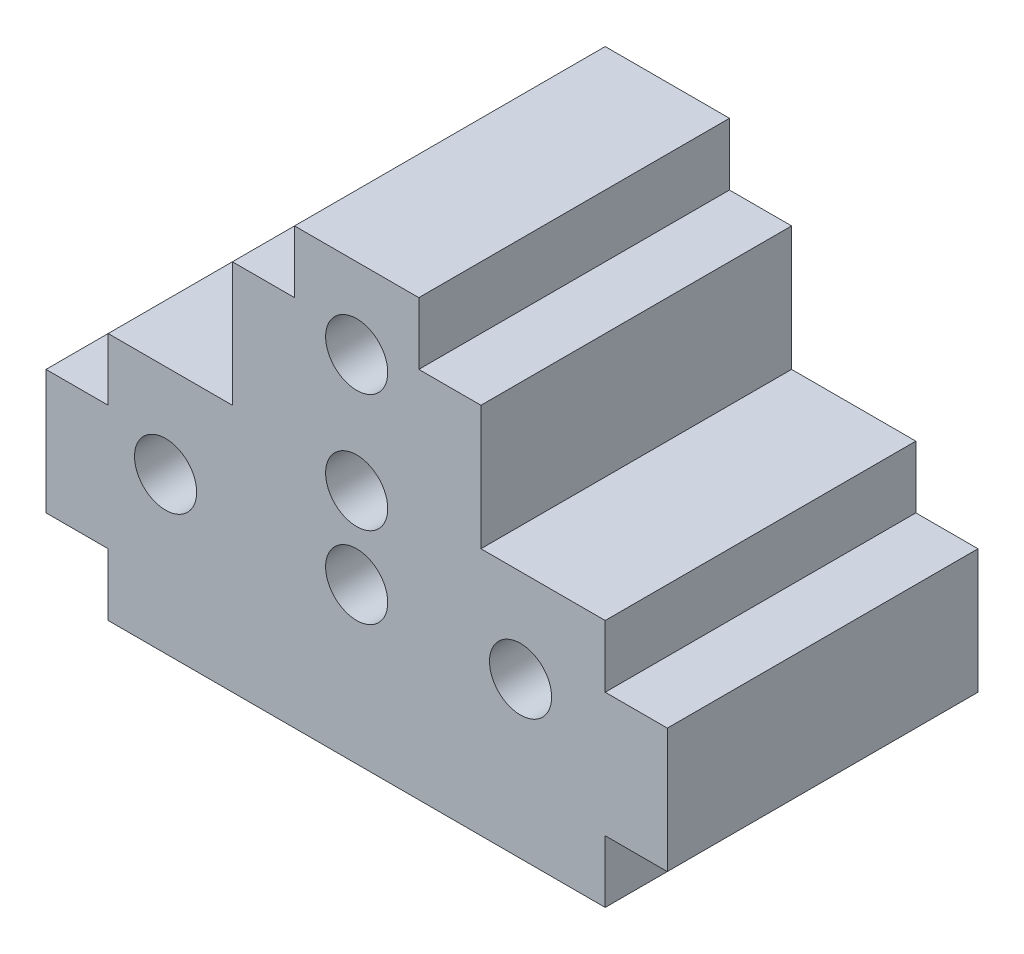
ISO-10303-21;
HEADER;
FILE_DESCRIPTION(('STEP AP214'),'2;1');
FILE_NAME('part.step','',(''),(''),'','','');
FILE_SCHEMA(('AUTOMOTIVE_DESIGN { 1 0 10303 214 1 1 1 1 }'));
ENDSEC;
DATA;
#1=APPLICATION_CONTEXT('core data for automotive mechanical design processes');
#2=APPLICATION_PROTOCOL_DEFINITION('international standard','automotive_design',2000,#1);
#3=PRODUCT_CONTEXT('',#1,'mechanical');
#4=PRODUCT('Part','Part','',(#3));
#5=PRODUCT_RELATED_PRODUCT_CATEGORY('part','',(#4));
#6=PRODUCT_DEFINITION_FORMATION('','',#4);
#7=PRODUCT_DEFINITION_CONTEXT('part definition',#1,'design');
#8=PRODUCT_DEFINITION('design','',#6,#7);
#9=PRODUCT_DEFINITION_SHAPE('','',#8);
#10=(LENGTH_UNIT() NAMED_UNIT(*) SI_UNIT(.MILLI.,.METRE.));
#11=(NAMED_UNIT(*) PLANE_ANGLE_UNIT() SI_UNIT($,.RADIAN.));
#12=(NAMED_UNIT(*) SI_UNIT($,.STERADIAN.) SOLID_ANGLE_UNIT());
#13=UNCERTAINTY_MEASURE_WITH_UNIT(LENGTH_MEASURE(1.E-05),#10,'distance_accuracy_value','');
#14=(GEOMETRIC_REPRESENTATION_CONTEXT(3) GLOBAL_UNCERTAINTY_ASSIGNED_CONTEXT((#13)) GLOBAL_UNIT_ASSIGNED_CONTEXT((#10,
#11,#12)) REPRESENTATION_CONTEXT('',''));
#15=CARTESIAN_POINT('',(0.,0.,0.));
#16=DIRECTION('',(0.,0.,1.));
#17=DIRECTION('',(1.,0.,0.));
#18=AXIS2_PLACEMENT_3D('',#15,#16,#17);
#19=CARTESIAN_POINT('',(-8.,0.,5.));
#20=DIRECTION('',(0.,1.,0.));
#21=DIRECTION('',(0.,0.,1.));
#22=AXIS2_PLACEMENT_3D('',#19,#20,#21);
#23=PLANE('',#22);
#24=DIRECTION('',(1.,0.,0.));
#25=VECTOR('',#24,1.);
#26=CARTESIAN_POINT('',(-8.,0.,-5.));
#27=LINE('',#26,#25);
#28=CARTESIAN_POINT('',(-8.,0.,-5.));
#29=VERTEX_POINT('',#28);
#30=CARTESIAN_POINT('',(8.,0.,-5.));
#31=VERTEX_POINT('',#30);
#32=EDGE_CURVE('E215',#29,#31,#27,.T.);
#33=ORIENTED_EDGE('',*,*,#32,.T.);
#34=DIRECTION('',(0.,0.,-1.));
#35=VECTOR('',#34,1.);
#36=CARTESIAN_POINT('',(8.,0.,5.));
#37=LINE('',#36,#35);
#38=CARTESIAN_POINT('',(8.,0.,5.));
#39=VERTEX_POINT('',#38);
#40=EDGE_CURVE('E11',#39,#31,#37,.T.);
#41=ORIENTED_EDGE('',*,*,#40,.F.);
#42=DIRECTION('',(1.,0.,0.));
#43=VECTOR('',#42,1.);
#44=CARTESIAN_POINT('',(-8.,0.,5.));
#45=LINE('',#44,#43);
#46=CARTESIAN_POINT('',(-8.,0.,5.));
#47=VERTEX_POINT('',#46);
#48=EDGE_CURVE('E274',#47,#39,#45,.T.);
#49=ORIENTED_EDGE('',*,*,#48,.F.);
#50=DIRECTION('',(0.,0.,-1.));
#51=VECTOR('',#50,1.);
#52=CARTESIAN_POINT('',(-8.,0.,5.));
#53=LINE('',#52,#51);
#54=EDGE_CURVE('E211',#47,#29,#53,.T.);
#55=ORIENTED_EDGE('',*,*,#54,.T.);
#56=EDGE_LOOP('',(#33,#41,#49,#55));
#57=FACE_BOUND('',#56,.T.);
#58=ADVANCED_FACE('F42',(#57),#23,.F.);
#59=CARTESIAN_POINT('',(8.,0.,5.));
#60=DIRECTION('',(-1.,0.,0.));
#61=DIRECTION('',(0.,0.,1.));
#62=AXIS2_PLACEMENT_3D('',#59,#60,#61);
#63=PLANE('',#62);
#64=DIRECTION('',(0.,1.,0.));
#65=VECTOR('',#64,1.);
#66=CARTESIAN_POINT('',(8.,0.,-5.));
#67=LINE('',#66,#65);
#68=CARTESIAN_POINT('',(8.,2.,-5.));
#69=VERTEX_POINT('',#68);
#70=EDGE_CURVE('E219',#31,#69,#67,.T.);
#71=ORIENTED_EDGE('',*,*,#70,.T.);
#72=DIRECTION('',(0.,0.,-1.));
#73=VECTOR('',#72,1.);
#74=CARTESIAN_POINT('',(8.,2.,5.));
#75=LINE('',#74,#73);
#76=CARTESIAN_POINT('',(8.,2.,5.));
#77=VERTEX_POINT('',#76);
#78=EDGE_CURVE('E51',#77,#69,#75,.T.);
#79=ORIENTED_EDGE('',*,*,#78,.F.);
#80=DIRECTION('',(0.,1.,0.));
#81=VECTOR('',#80,1.);
#82=CARTESIAN_POINT('',(8.,0.,5.));
#83=LINE('',#82,#81);
#84=EDGE_CURVE('E138',#39,#77,#83,.T.);
#85=ORIENTED_EDGE('',*,*,#84,.F.);
#86=ORIENTED_EDGE('',*,*,#40,.T.);
#87=EDGE_LOOP('',(#71,#79,#85,#86));
#88=FACE_BOUND('',#87,.T.);
#89=ADVANCED_FACE('F426',(#88),#63,.F.);
#90=CARTESIAN_POINT('',(8.,2.,5.));
#91=DIRECTION('',(0.,1.,0.));
#92=DIRECTION('',(-1.,0.,0.));
#93=AXIS2_PLACEMENT_3D('',#90,#91,#92);
#94=PLANE('',#93);
#95=DIRECTION('',(1.,0.,0.));
#96=VECTOR('',#95,1.);
#97=CARTESIAN_POINT('',(8.,2.,-5.));
#98=LINE('',#97,#96);
#99=CARTESIAN_POINT('',(10.,2.,-5.));
#100=VERTEX_POINT('',#99);
#101=EDGE_CURVE('E223',#69,#100,#98,.T.);
#102=ORIENTED_EDGE('',*,*,#101,.T.);
#103=DIRECTION('',(0.,0.,-1.));
#104=VECTOR('',#103,1.);
#105=CARTESIAN_POINT('',(10.,2.,5.));
#106=LINE('',#105,#104);
#107=CARTESIAN_POINT('',(10.,2.,5.));
#108=VERTEX_POINT('',#107);
#109=EDGE_CURVE('E333',#108,#100,#106,.T.);
#110=ORIENTED_EDGE('',*,*,#109,.F.);
#111=DIRECTION('',(1.,0.,0.));
#112=VECTOR('',#111,1.);
#113=CARTESIAN_POINT('',(8.,2.,5.));
#114=LINE('',#113,#112);
#115=EDGE_CURVE('E343',#77,#108,#114,.T.);
#116=ORIENTED_EDGE('',*,*,#115,.F.);
#117=ORIENTED_EDGE('',*,*,#78,.T.);
#118=EDGE_LOOP('',(#102,#110,#116,#117));
#119=FACE_BOUND('',#118,.T.);
#120=ADVANCED_FACE('F341',(#119),#94,.F.);
#121=CARTESIAN_POINT('',(10.,2.,5.));
#122=DIRECTION('',(-1.,0.,0.));
#123=DIRECTION('',(0.,0.,1.));
#124=AXIS2_PLACEMENT_3D('',#121,#122,#123);
#125=PLANE('',#124);
#126=DIRECTION('',(0.,1.,0.));
#127=VECTOR('',#126,1.);
#128=CARTESIAN_POINT('',(10.,2.,-5.));
#129=LINE('',#128,#127);
#130=CARTESIAN_POINT('',(10.,6.,-5.));
#131=VERTEX_POINT('',#130);
#132=EDGE_CURVE('E226',#100,#131,#129,.T.);
#133=ORIENTED_EDGE('',*,*,#132,.T.);
#134=DIRECTION('',(0.,0.,-1.));
#135=VECTOR('',#134,1.);
#136=CARTESIAN_POINT('',(10.,6.,5.));
#137=LINE('',#136,#135);
#138=CARTESIAN_POINT('',(10.,6.,5.));
#139=VERTEX_POINT('',#138);
#140=EDGE_CURVE('E329',#139,#131,#137,.T.);
#141=ORIENTED_EDGE('',*,*,#140,.F.);
#142=DIRECTION('',(0.,1.,0.));
#143=VECTOR('',#142,1.);
#144=CARTESIAN_POINT('',(10.,2.,5.));
#145=LINE('',#144,#143);
#146=EDGE_CURVE('E362',#108,#139,#145,.T.);
#147=ORIENTED_EDGE('',*,*,#146,.F.);
#148=ORIENTED_EDGE('',*,*,#109,.T.);
#149=EDGE_LOOP('',(#133,#141,#147,#148));
#150=FACE_BOUND('',#149,.T.);
#151=ADVANCED_FACE('F352',(#150),#125,.F.);
#152=CARTESIAN_POINT('',(10.,6.,5.));
#153=DIRECTION('',(0.,-1.,0.));
#154=DIRECTION('',(0.,0.,-1.));
#155=AXIS2_PLACEMENT_3D('',#152,#153,#154);
#156=PLANE('',#155);
#157=DIRECTION('',(-1.,0.,0.));
#158=VECTOR('',#157,1.);
#159=CARTESIAN_POINT('',(10.,6.,-5.));
#160=LINE('',#159,#158);
#161=CARTESIAN_POINT('',(8.,6.,-5.));
#162=VERTEX_POINT('',#161);
#163=EDGE_CURVE('E229',#131,#162,#160,.T.);
#164=ORIENTED_EDGE('',*,*,#163,.T.);
#165=DIRECTION('',(0.,0.,-1.));
#166=VECTOR('',#165,1.);
#167=CARTESIAN_POINT('',(8.,6.,5.));
#168=LINE('',#167,#166);
#169=CARTESIAN_POINT('',(8.,6.,5.));
#170=VERTEX_POINT('',#169);
#171=EDGE_CURVE('E325',#170,#162,#168,.T.);
#172=ORIENTED_EDGE('',*,*,#171,.F.);
#173=DIRECTION('',(-1.,0.,0.));
#174=VECTOR('',#173,1.);
#175=CARTESIAN_POINT('',(10.,6.,5.));
#176=LINE('',#175,#174);
#177=EDGE_CURVE('E358',#139,#170,#176,.T.);
#178=ORIENTED_EDGE('',*,*,#177,.F.);
#179=ORIENTED_EDGE('',*,*,#140,.T.);
#180=EDGE_LOOP('',(#164,#172,#178,#179));
#181=FACE_BOUND('',#180,.T.);
#182=ADVANCED_FACE('F356',(#181),#156,.F.);
#183=CARTESIAN_POINT('',(8.,6.,5.));
#184=DIRECTION('',(-1.,0.,0.));
#185=DIRECTION('',(0.,0.,1.));
#186=AXIS2_PLACEMENT_3D('',#183,#184,#185);
#187=PLANE('',#186);
#188=DIRECTION('',(0.,1.,0.));
#189=VECTOR('',#188,1.);
#190=CARTESIAN_POINT('',(8.,6.,-5.));
#191=LINE('',#190,#189);
#192=CARTESIAN_POINT('',(8.,8.,-5.));
#193=VERTEX_POINT('',#192);
#194=EDGE_CURVE('E232',#162,#193,#191,.T.);
#195=ORIENTED_EDGE('',*,*,#194,.T.);
#196=DIRECTION('',(0.,0.,-1.));
#197=VECTOR('',#196,1.);
#198=CARTESIAN_POINT('',(8.,8.,5.));
#199=LINE('',#198,#197);
#200=CARTESIAN_POINT('',(8.,8.,5.));
#201=VERTEX_POINT('',#200);
#202=EDGE_CURVE('E321',#201,#193,#199,.T.);
#203=ORIENTED_EDGE('',*,*,#202,.F.);
#204=DIRECTION('',(0.,1.,0.));
#205=VECTOR('',#204,1.);
#206=CARTESIAN_POINT('',(8.,6.,5.));
#207=LINE('',#206,#205);
#208=EDGE_CURVE('E361',#170,#201,#207,.T.);
#209=ORIENTED_EDGE('',*,*,#208,.F.);
#210=ORIENTED_EDGE('',*,*,#171,.T.);
#211=EDGE_LOOP('',(#195,#203,#209,#210));
#212=FACE_BOUND('',#211,.T.);
#213=ADVANCED_FACE('F439',(#212),#187,.F.);
#214=CARTESIAN_POINT('',(8.,8.,5.));
#215=DIRECTION('',(0.,-1.,0.));
#216=DIRECTION('',(0.,0.,-1.));
#217=AXIS2_PLACEMENT_3D('',#214,#215,#216);
#218=PLANE('',#217);
#219=DIRECTION('',(-1.,0.,0.));
#220=VECTOR('',#219,1.);
#221=CARTESIAN_POINT('',(8.,8.,-5.));
#222=LINE('',#221,#220);
#223=CARTESIAN_POINT('',(4.,8.,-5.));
#224=VERTEX_POINT('',#223);
#225=EDGE_CURVE('E235',#193,#224,#222,.T.);
#226=ORIENTED_EDGE('',*,*,#225,.T.);
#227=DIRECTION('',(0.,0.,-1.));
#228=VECTOR('',#227,1.);
#229=CARTESIAN_POINT('',(4.,8.,5.));
#230=LINE('',#229,#228);
#231=CARTESIAN_POINT('',(4.,8.,5.));
#232=VERTEX_POINT('',#231);
#233=EDGE_CURVE('E317',#232,#224,#230,.T.);
#234=ORIENTED_EDGE('',*,*,#233,.F.);
#235=DIRECTION('',(-1.,0.,0.));
#236=VECTOR('',#235,1.);
#237=CARTESIAN_POINT('',(8.,8.,5.));
#238=LINE('',#237,#236);
#239=EDGE_CURVE('E366',#201,#232,#238,.T.);
#240=ORIENTED_EDGE('',*,*,#239,.F.);
#241=ORIENTED_EDGE('',*,*,#202,.T.);
#242=EDGE_LOOP('',(#226,#234,#240,#241));
#243=FACE_BOUND('',#242,.T.);
#244=ADVANCED_FACE('F442',(#243),#218,.F.);
#245=CARTESIAN_POINT('',(4.,8.,5.));
#246=DIRECTION('',(-1.,0.,0.));
#247=DIRECTION('',(0.,0.,1.));
#248=AXIS2_PLACEMENT_3D('',#245,#246,#247);
#249=PLANE('',#248);
#250=DIRECTION('',(0.,1.,0.));
#251=VECTOR('',#250,1.);
#252=CARTESIAN_POINT('',(4.,8.,-5.));
#253=LINE('',#252,#251);
#254=CARTESIAN_POINT('',(4.,12.,-5.));
#255=VERTEX_POINT('',#254);
#256=EDGE_CURVE('E238',#224,#255,#253,.T.);
#257=ORIENTED_EDGE('',*,*,#256,.T.);
#258=DIRECTION('',(0.,0.,-1.));
#259=VECTOR('',#258,1.);
#260=CARTESIAN_POINT('',(4.,12.,5.));
#261=LINE('',#260,#259);
#262=CARTESIAN_POINT('',(4.,12.,5.));
#263=VERTEX_POINT('',#262);
#264=EDGE_CURVE('E313',#263,#255,#261,.T.);
#265=ORIENTED_EDGE('',*,*,#264,.F.);
#266=DIRECTION('',(0.,1.,0.));
#267=VECTOR('',#266,1.);
#268=CARTESIAN_POINT('',(4.,8.,5.));
#269=LINE('',#268,#267);
#270=EDGE_CURVE('E373',#232,#263,#269,.T.);
#271=ORIENTED_EDGE('',*,*,#270,.F.);
#272=ORIENTED_EDGE('',*,*,#233,.T.);
#273=EDGE_LOOP('',(#257,#265,#271,#272));
#274=FACE_BOUND('',#273,.T.);
#275=ADVANCED_FACE('F446',(#274),#249,.F.);
#276=CARTESIAN_POINT('',(4.,12.,5.));
#277=DIRECTION('',(0.,-1.,0.));
#278=DIRECTION('',(0.,0.,-1.));
#279=AXIS2_PLACEMENT_3D('',#276,#277,#278);
#280=PLANE('',#279);
#281=DIRECTION('',(-1.,0.,0.));
#282=VECTOR('',#281,1.);
#283=CARTESIAN_POINT('',(4.,12.,-5.));
#284=LINE('',#283,#282);
#285=CARTESIAN_POINT('',(2.,12.,-5.));
#286=VERTEX_POINT('',#285);
#287=EDGE_CURVE('E241',#255,#286,#284,.T.);
#288=ORIENTED_EDGE('',*,*,#287,.T.);
#289=DIRECTION('',(0.,0.,-1.));
#290=VECTOR('',#289,1.);
#291=CARTESIAN_POINT('',(2.,12.,5.));
#292=LINE('',#291,#290);
#293=CARTESIAN_POINT('',(2.,12.,5.));
#294=VERTEX_POINT('',#293);
#295=EDGE_CURVE('E309',#294,#286,#292,.T.);
#296=ORIENTED_EDGE('',*,*,#295,.F.);
#297=DIRECTION('',(-1.,0.,0.));
#298=VECTOR('',#297,1.);
#299=CARTESIAN_POINT('',(4.,12.,5.));
#300=LINE('',#299,#298);
#301=EDGE_CURVE('E376',#263,#294,#300,.T.);
#302=ORIENTED_EDGE('',*,*,#301,.F.);
#303=ORIENTED_EDGE('',*,*,#264,.T.);
#304=EDGE_LOOP('',(#288,#296,#302,#303));
#305=FACE_BOUND('',#304,.T.);
#306=ADVANCED_FACE('F450',(#305),#280,.F.);
#307=CARTESIAN_POINT('',(2.,12.,5.));
#308=DIRECTION('',(-1.,0.,0.));
#309=DIRECTION('',(0.,0.,1.));
#310=AXIS2_PLACEMENT_3D('',#307,#308,#309);
#311=PLANE('',#310);
#312=DIRECTION('',(0.,1.,0.));
#313=VECTOR('',#312,1.);
#314=CARTESIAN_POINT('',(2.,12.,-5.));
#315=LINE('',#314,#313);
#316=CARTESIAN_POINT('',(2.,14.,-5.));
#317=VERTEX_POINT('',#316);
#318=EDGE_CURVE('E244',#286,#317,#315,.T.);
#319=ORIENTED_EDGE('',*,*,#318,.T.);
#320=DIRECTION('',(0.,0.,-1.));
#321=VECTOR('',#320,1.);
#322=CARTESIAN_POINT('',(2.,14.,5.));
#323=LINE('',#322,#321);
#324=CARTESIAN_POINT('',(2.,14.,5.));
#325=VERTEX_POINT('',#324);
#326=EDGE_CURVE('E305',#325,#317,#323,.T.);
#327=ORIENTED_EDGE('',*,*,#326,.F.);
#328=DIRECTION('',(0.,1.,0.));
#329=VECTOR('',#328,1.);
#330=CARTESIAN_POINT('',(2.,12.,5.));
#331=LINE('',#330,#329);
#332=EDGE_CURVE('E379',#294,#325,#331,.T.);
#333=ORIENTED_EDGE('',*,*,#332,.F.);
#334=ORIENTED_EDGE('',*,*,#295,.T.);
#335=EDGE_LOOP('',(#319,#327,#333,#334));
#336=FACE_BOUND('',#335,.T.);
#337=ADVANCED_FACE('F454',(#336),#311,.F.);
#338=CARTESIAN_POINT('',(-2.,14.,5.));
#339=DIRECTION('',(0.,-1.,0.));
#340=DIRECTION('',(0.,0.,-1.));
#341=AXIS2_PLACEMENT_3D('',#338,#339,#340);
#342=PLANE('',#341);
#343=DIRECTION('',(-1.,0.,0.));
#344=VECTOR('',#343,1.);
#345=CARTESIAN_POINT('',(-2.,14.,-5.));
#346=LINE('',#345,#344);
#347=CARTESIAN_POINT('',(-2.,14.,-5.));
#348=VERTEX_POINT('',#347);
#349=EDGE_CURVE('E247',#317,#348,#346,.T.);
#350=ORIENTED_EDGE('',*,*,#349,.T.);
#351=DIRECTION('',(0.,0.,-1.));
#352=VECTOR('',#351,1.);
#353=CARTESIAN_POINT('',(-2.,14.,5.));
#354=LINE('',#353,#352);
#355=CARTESIAN_POINT('',(-2.,14.,5.));
#356=VERTEX_POINT('',#355);
#357=EDGE_CURVE('E301',#356,#348,#354,.T.);
#358=ORIENTED_EDGE('',*,*,#357,.F.);
#359=DIRECTION('',(-1.,0.,0.));
#360=VECTOR('',#359,1.);
#361=CARTESIAN_POINT('',(-2.,14.,5.));
#362=LINE('',#361,#360);
#363=EDGE_CURVE('E382',#325,#356,#362,.T.);
#364=ORIENTED_EDGE('',*,*,#363,.F.);
#365=ORIENTED_EDGE('',*,*,#326,.T.);
#366=EDGE_LOOP('',(#350,#358,#364,#365));
#367=FACE_BOUND('',#366,.T.);
#368=ADVANCED_FACE('F458',(#367),#342,.F.);
#369=CARTESIAN_POINT('',(-2.,12.,5.));
#370=DIRECTION('',(1.,0.,0.));
#371=DIRECTION('',(0.,0.,-1.));
#372=AXIS2_PLACEMENT_3D('',#369,#370,#371);
#373=PLANE('',#372);
#374=DIRECTION('',(0.,-1.,0.));
#375=VECTOR('',#374,1.);
#376=CARTESIAN_POINT('',(-2.,12.,-5.));
#377=LINE('',#376,#375);
#378=CARTESIAN_POINT('',(-2.,12.,-5.));
#379=VERTEX_POINT('',#378);
#380=EDGE_CURVE('E250',#348,#379,#377,.T.);
#381=ORIENTED_EDGE('',*,*,#380,.T.);
#382=DIRECTION('',(0.,0.,-1.));
#383=VECTOR('',#382,1.);
#384=CARTESIAN_POINT('',(-2.,12.,5.));
#385=LINE('',#384,#383);
#386=CARTESIAN_POINT('',(-2.,12.,5.));
#387=VERTEX_POINT('',#386);
#388=EDGE_CURVE('E297',#387,#379,#385,.T.);
#389=ORIENTED_EDGE('',*,*,#388,.F.);
#390=DIRECTION('',(0.,-1.,0.));
#391=VECTOR('',#390,1.);
#392=CARTESIAN_POINT('',(-2.,12.,5.));
#393=LINE('',#392,#391);
#394=EDGE_CURVE('E385',#356,#387,#393,.T.);
#395=ORIENTED_EDGE('',*,*,#394,.F.);
#396=ORIENTED_EDGE('',*,*,#357,.T.);
#397=EDGE_LOOP('',(#381,#389,#395,#396));
#398=FACE_BOUND('',#397,.T.);
#399=ADVANCED_FACE('F462',(#398),#373,.F.);
#400=CARTESIAN_POINT('',(-4.,12.,5.));
#401=DIRECTION('',(0.,-1.,0.));
#402=DIRECTION('',(0.,0.,-1.));
#403=AXIS2_PLACEMENT_3D('',#400,#401,#402);
#404=PLANE('',#403);
#405=DIRECTION('',(-1.,0.,0.));
#406=VECTOR('',#405,1.);
#407=CARTESIAN_POINT('',(-4.,12.,-5.));
#408=LINE('',#407,#406);
#409=CARTESIAN_POINT('',(-4.,12.,-5.));
#410=VERTEX_POINT('',#409);
#411=EDGE_CURVE('E253',#379,#410,#408,.T.);
#412=ORIENTED_EDGE('',*,*,#411,.T.);
#413=DIRECTION('',(0.,0.,-1.));
#414=VECTOR('',#413,1.);
#415=CARTESIAN_POINT('',(-4.,12.,5.));
#416=LINE('',#415,#414);
#417=CARTESIAN_POINT('',(-4.,12.,5.));
#418=VERTEX_POINT('',#417);
#419=EDGE_CURVE('E293',#418,#410,#416,.T.);
#420=ORIENTED_EDGE('',*,*,#419,.F.);
#421=DIRECTION('',(-1.,0.,0.));
#422=VECTOR('',#421,1.);
#423=CARTESIAN_POINT('',(-4.,12.,5.));
#424=LINE('',#423,#422);
#425=EDGE_CURVE('E388',#387,#418,#424,.T.);
#426=ORIENTED_EDGE('',*,*,#425,.F.);
#427=ORIENTED_EDGE('',*,*,#388,.T.);
#428=EDGE_LOOP('',(#412,#420,#426,#427));
#429=FACE_BOUND('',#428,.T.);
#430=ADVANCED_FACE('F466',(#429),#404,.F.);
#431=CARTESIAN_POINT('',(-4.,8.,5.));
#432=DIRECTION('',(1.,0.,0.));
#433=DIRECTION('',(0.,0.,-1.));
#434=AXIS2_PLACEMENT_3D('',#431,#432,#433);
#435=PLANE('',#434);
#436=DIRECTION('',(0.,-1.,0.));
#437=VECTOR('',#436,1.);
#438=CARTESIAN_POINT('',(-4.,8.,-5.));
#439=LINE('',#438,#437);
#440=CARTESIAN_POINT('',(-4.,8.,-5.));
#441=VERTEX_POINT('',#440);
#442=EDGE_CURVE('E256',#410,#441,#439,.T.);
#443=ORIENTED_EDGE('',*,*,#442,.T.);
#444=DIRECTION('',(0.,0.,-1.));
#445=VECTOR('',#444,1.);
#446=CARTESIAN_POINT('',(-4.,8.,5.));
#447=LINE('',#446,#445);
#448=CARTESIAN_POINT('',(-4.,8.,5.));
#449=VERTEX_POINT('',#448);
#450=EDGE_CURVE('E289',#449,#441,#447,.T.);
#451=ORIENTED_EDGE('',*,*,#450,.F.);
#452=DIRECTION('',(0.,-1.,0.));
#453=VECTOR('',#452,1.);
#454=CARTESIAN_POINT('',(-4.,8.,5.));
#455=LINE('',#454,#453);
#456=EDGE_CURVE('E391',#418,#449,#455,.T.);
#457=ORIENTED_EDGE('',*,*,#456,.F.);
#458=ORIENTED_EDGE('',*,*,#419,.T.);
#459=EDGE_LOOP('',(#443,#451,#457,#458));
#460=FACE_BOUND('',#459,.T.);
#461=ADVANCED_FACE('F470',(#460),#435,.F.);
#462=CARTESIAN_POINT('',(-8.,8.,5.));
#463=DIRECTION('',(0.,-1.,0.));
#464=DIRECTION('',(0.,0.,-1.));
#465=AXIS2_PLACEMENT_3D('',#462,#463,#464);
#466=PLANE('',#465);
#467=DIRECTION('',(-1.,0.,0.));
#468=VECTOR('',#467,1.);
#469=CARTESIAN_POINT('',(-8.,8.,-5.));
#470=LINE('',#469,#468);
#471=CARTESIAN_POINT('',(-8.,8.,-5.));
#472=VERTEX_POINT('',#471);
#473=EDGE_CURVE('E259',#441,#472,#470,.T.);
#474=ORIENTED_EDGE('',*,*,#473,.T.);
#475=DIRECTION('',(0.,0.,-1.));
#476=VECTOR('',#475,1.);
#477=CARTESIAN_POINT('',(-8.,8.,5.));
#478=LINE('',#477,#476);
#479=CARTESIAN_POINT('',(-8.,8.,5.));
#480=VERTEX_POINT('',#479);
#481=EDGE_CURVE('E285',#480,#472,#478,.T.);
#482=ORIENTED_EDGE('',*,*,#481,.F.);
#483=DIRECTION('',(-1.,0.,0.));
#484=VECTOR('',#483,1.);
#485=CARTESIAN_POINT('',(-8.,8.,5.));
#486=LINE('',#485,#484);
#487=EDGE_CURVE('E394',#449,#480,#486,.T.);
#488=ORIENTED_EDGE('',*,*,#487,.F.);
#489=ORIENTED_EDGE('',*,*,#450,.T.);
#490=EDGE_LOOP('',(#474,#482,#488,#489));
#491=FACE_BOUND('',#490,.T.);
#492=ADVANCED_FACE('F474',(#491),#466,.F.);
#493=CARTESIAN_POINT('',(-8.,6.,5.));
#494=DIRECTION('',(1.,0.,0.));
#495=DIRECTION('',(0.,0.,-1.));
#496=AXIS2_PLACEMENT_3D('',#493,#494,#495);
#497=PLANE('',#496);
#498=DIRECTION('',(0.,-1.,0.));
#499=VECTOR('',#498,1.);
#500=CARTESIAN_POINT('',(-8.,6.,-5.));
#501=LINE('',#500,#499);
#502=CARTESIAN_POINT('',(-8.,6.,-5.));
#503=VERTEX_POINT('',#502);
#504=EDGE_CURVE('E262',#472,#503,#501,.T.);
#505=ORIENTED_EDGE('',*,*,#504,.T.);
#506=DIRECTION('',(0.,0.,-1.));
#507=VECTOR('',#506,1.);
#508=CARTESIAN_POINT('',(-8.,6.,5.));
#509=LINE('',#508,#507);
#510=CARTESIAN_POINT('',(-8.,6.,5.));
#511=VERTEX_POINT('',#510);
#512=EDGE_CURVE('E281',#511,#503,#509,.T.);
#513=ORIENTED_EDGE('',*,*,#512,.F.);
#514=DIRECTION('',(0.,-1.,0.));
#515=VECTOR('',#514,1.);
#516=CARTESIAN_POINT('',(-8.,6.,5.));
#517=LINE('',#516,#515);
#518=EDGE_CURVE('E397',#480,#511,#517,.T.);
#519=ORIENTED_EDGE('',*,*,#518,.F.);
#520=ORIENTED_EDGE('',*,*,#481,.T.);
#521=EDGE_LOOP('',(#505,#513,#519,#520));
#522=FACE_BOUND('',#521,.T.);
#523=ADVANCED_FACE('F405',(#522),#497,.F.);
#524=CARTESIAN_POINT('',(-10.,6.,5.));
#525=DIRECTION('',(0.,-1.,0.));
#526=DIRECTION('',(0.,0.,-1.));
#527=AXIS2_PLACEMENT_3D('',#524,#525,#526);
#528=PLANE('',#527);
#529=DIRECTION('',(-1.,0.,0.));
#530=VECTOR('',#529,1.);
#531=CARTESIAN_POINT('',(-10.,6.,-5.));
#532=LINE('',#531,#530);
#533=CARTESIAN_POINT('',(-10.,6.,-5.));
#534=VERTEX_POINT('',#533);
#535=EDGE_CURVE('E265',#503,#534,#532,.T.);
#536=ORIENTED_EDGE('',*,*,#535,.T.);
#537=DIRECTION('',(0.,0.,-1.));
#538=VECTOR('',#537,1.);
#539=CARTESIAN_POINT('',(-10.,6.,5.));
#540=LINE('',#539,#538);
#541=CARTESIAN_POINT('',(-10.,6.,5.));
#542=VERTEX_POINT('',#541);
#543=EDGE_CURVE('E204',#542,#534,#540,.T.);
#544=ORIENTED_EDGE('',*,*,#543,.F.);
#545=DIRECTION('',(-1.,0.,0.));
#546=VECTOR('',#545,1.);
#547=CARTESIAN_POINT('',(-10.,6.,5.));
#548=LINE('',#547,#546);
#549=EDGE_CURVE('E193',#511,#542,#548,.T.);
#550=ORIENTED_EDGE('',*,*,#549,.F.);
#551=ORIENTED_EDGE('',*,*,#512,.T.);
#552=EDGE_LOOP('',(#536,#544,#550,#551));
#553=FACE_BOUND('',#552,.T.);
#554=ADVANCED_FACE('F409',(#553),#528,.F.);
#555=CARTESIAN_POINT('',(-10.,2.,5.));
#556=DIRECTION('',(1.,0.,0.));
#557=DIRECTION('',(0.,0.,-1.));
#558=AXIS2_PLACEMENT_3D('',#555,#556,#557);
#559=PLANE('',#558);
#560=DIRECTION('',(0.,-1.,0.));
#561=VECTOR('',#560,1.);
#562=CARTESIAN_POINT('',(-10.,2.,-5.));
#563=LINE('',#562,#561);
#564=CARTESIAN_POINT('',(-10.,2.,-5.));
#565=VERTEX_POINT('',#564);
#566=EDGE_CURVE('E202',#534,#565,#563,.T.);
#567=ORIENTED_EDGE('',*,*,#566,.T.);
#568=DIRECTION('',(0.,0.,-1.));
#569=VECTOR('',#568,1.);
#570=CARTESIAN_POINT('',(-10.,2.,5.));
#571=LINE('',#570,#569);
#572=CARTESIAN_POINT('',(-10.,2.,5.));
#573=VERTEX_POINT('',#572);
#574=EDGE_CURVE('E199',#573,#565,#571,.T.);
#575=ORIENTED_EDGE('',*,*,#574,.F.);
#576=DIRECTION('',(0.,-1.,0.));
#577=VECTOR('',#576,1.);
#578=CARTESIAN_POINT('',(-10.,2.,5.));
#579=LINE('',#578,#577);
#580=EDGE_CURVE('E187',#542,#573,#579,.T.);
#581=ORIENTED_EDGE('',*,*,#580,.F.);
#582=ORIENTED_EDGE('',*,*,#543,.T.);
#583=EDGE_LOOP('',(#567,#575,#581,#582));
#584=FACE_BOUND('',#583,.T.);
#585=ADVANCED_FACE('F200',(#584),#559,.F.);
#586=CARTESIAN_POINT('',(-8.,2.,5.));
#587=DIRECTION('',(0.,1.,0.));
#588=DIRECTION('',(-1.,0.,0.));
#589=AXIS2_PLACEMENT_3D('',#586,#587,#588);
#590=PLANE('',#589);
#591=DIRECTION('',(1.,0.,0.));
#592=VECTOR('',#591,1.);
#593=CARTESIAN_POINT('',(-8.,2.,-5.));
#594=LINE('',#593,#592);
#595=CARTESIAN_POINT('',(-8.,2.,-5.));
#596=VERTEX_POINT('',#595);
#597=EDGE_CURVE('E124',#565,#596,#594,.T.);
#598=ORIENTED_EDGE('',*,*,#597,.T.);
#599=DIRECTION('',(0.,0.,-1.));
#600=VECTOR('',#599,1.);
#601=CARTESIAN_POINT('',(-8.,2.,5.));
#602=LINE('',#601,#600);
#603=CARTESIAN_POINT('',(-8.,2.,5.));
#604=VERTEX_POINT('',#603);
#605=EDGE_CURVE('E205',#604,#596,#602,.T.);
#606=ORIENTED_EDGE('',*,*,#605,.F.);
#607=DIRECTION('',(1.,0.,0.));
#608=VECTOR('',#607,1.);
#609=CARTESIAN_POINT('',(-8.,2.,5.));
#610=LINE('',#609,#608);
#611=EDGE_CURVE('E191',#573,#604,#610,.T.);
#612=ORIENTED_EDGE('',*,*,#611,.F.);
#613=ORIENTED_EDGE('',*,*,#574,.T.);
#614=EDGE_LOOP('',(#598,#606,#612,#613));
#615=FACE_BOUND('',#614,.T.);
#616=ADVANCED_FACE('F207',(#615),#590,.F.);
#617=CARTESIAN_POINT('',(-8.,0.,5.));
#618=DIRECTION('',(1.,0.,0.));
#619=DIRECTION('',(0.,0.,-1.));
#620=AXIS2_PLACEMENT_3D('',#617,#618,#619);
#621=PLANE('',#620);
#622=DIRECTION('',(0.,-1.,0.));
#623=VECTOR('',#622,1.);
#624=CARTESIAN_POINT('',(-8.,0.,-5.));
#625=LINE('',#624,#623);
#626=EDGE_CURVE('E130',#596,#29,#625,.T.);
#627=ORIENTED_EDGE('',*,*,#626,.T.);
#628=ORIENTED_EDGE('',*,*,#54,.F.);
#629=DIRECTION('',(0.,-1.,0.));
#630=VECTOR('',#629,1.);
#631=CARTESIAN_POINT('',(-8.,0.,5.));
#632=LINE('',#631,#630);
#633=EDGE_CURVE('E59',#604,#47,#632,.T.);
#634=ORIENTED_EDGE('',*,*,#633,.F.);
#635=ORIENTED_EDGE('',*,*,#605,.T.);
#636=EDGE_LOOP('',(#627,#628,#634,#635));
#637=FACE_BOUND('',#636,.T.);
#638=ADVANCED_FACE('F413',(#637),#621,.F.);
#639=CARTESIAN_POINT('',(0.,0.,5.));
#640=DIRECTION('',(0.,0.,1.));
#641=DIRECTION('',(1.,0.,0.));
#642=AXIS2_PLACEMENT_3D('',#639,#640,#641);
#643=PLANE('',#642);
#644=CARTESIAN_POINT('',(5.27484341973252,5.,5.));
#645=DIRECTION('',(0.,0.,1.));
#646=DIRECTION('',(1.,0.,0.));
#647=AXIS2_PLACEMENT_3D('',#644,#645,#646);
#648=CIRCLE('',#647,1.);
#649=CARTESIAN_POINT('',(6.27484341973252,5.,5.));
#650=VERTEX_POINT('',#649);
#651=EDGE_CURVE('E721',#650,#650,#648,.T.);
#652=ORIENTED_EDGE('',*,*,#651,.F.);
#653=EDGE_LOOP('',(#652));
#654=FACE_BOUND('',#653,.T.);
#655=CARTESIAN_POINT('',(-6.15127894178039,5.,5.));
#656=DIRECTION('',(0.,0.,1.));
#657=DIRECTION('',(1.,0.,0.));
#658=AXIS2_PLACEMENT_3D('',#655,#656,#657);
#659=CIRCLE('',#658,1.);
#660=CARTESIAN_POINT('',(-5.15127894178039,5.,5.));
#661=VERTEX_POINT('',#660);
#662=EDGE_CURVE('E728',#661,#661,#659,.T.);
#663=ORIENTED_EDGE('',*,*,#662,.F.);
#664=EDGE_LOOP('',(#663));
#665=FACE_BOUND('',#664,.T.);
#666=CARTESIAN_POINT('',(0.,11.41463818513,5.));
#667=DIRECTION('',(0.,0.,1.));
#668=DIRECTION('',(1.,0.,0.));
#669=AXIS2_PLACEMENT_3D('',#666,#667,#668);
#670=CIRCLE('',#669,1.);
#671=CARTESIAN_POINT('',(1.,11.41463818513,5.));
#672=VERTEX_POINT('',#671);
#673=EDGE_CURVE('E752',#672,#672,#670,.T.);
#674=ORIENTED_EDGE('',*,*,#673,.F.);
#675=EDGE_LOOP('',(#674));
#676=FACE_BOUND('',#675,.T.);
#677=CARTESIAN_POINT('',(0.,7.61675092292261,5.));
#678=DIRECTION('',(0.,0.,1.));
#679=DIRECTION('',(1.,0.,0.));
#680=AXIS2_PLACEMENT_3D('',#677,#678,#679);
#681=CIRCLE('',#680,1.);
#682=CARTESIAN_POINT('',(1.,7.61675092292261,5.));
#683=VERTEX_POINT('',#682);
#684=EDGE_CURVE('E740',#683,#683,#681,.T.);
#685=ORIENTED_EDGE('',*,*,#684,.F.);
#686=EDGE_LOOP('',(#685));
#687=FACE_BOUND('',#686,.T.);
#688=CARTESIAN_POINT('',(0.,5.,5.));
#689=DIRECTION('',(0.,0.,1.));
#690=DIRECTION('',(1.,0.,0.));
#691=AXIS2_PLACEMENT_3D('',#688,#689,#690);
#692=CIRCLE('',#691,1.);
#693=CARTESIAN_POINT('',(1.,5.,5.));
#694=VERTEX_POINT('',#693);
#695=EDGE_CURVE('E736',#694,#694,#692,.T.);
#696=ORIENTED_EDGE('',*,*,#695,.F.);
#697=EDGE_LOOP('',(#696));
#698=FACE_BOUND('',#697,.T.);
#699=ORIENTED_EDGE('',*,*,#48,.T.);
#700=ORIENTED_EDGE('',*,*,#84,.T.);
#701=ORIENTED_EDGE('',*,*,#115,.T.);
#702=ORIENTED_EDGE('',*,*,#146,.T.);
#703=ORIENTED_EDGE('',*,*,#177,.T.);
#704=ORIENTED_EDGE('',*,*,#208,.T.);
#705=ORIENTED_EDGE('',*,*,#239,.T.);
#706=ORIENTED_EDGE('',*,*,#270,.T.);
#707=ORIENTED_EDGE('',*,*,#301,.T.);
#708=ORIENTED_EDGE('',*,*,#332,.T.);
#709=ORIENTED_EDGE('',*,*,#363,.T.);
#710=ORIENTED_EDGE('',*,*,#394,.T.);
#711=ORIENTED_EDGE('',*,*,#425,.T.);
#712=ORIENTED_EDGE('',*,*,#456,.T.);
#713=ORIENTED_EDGE('',*,*,#487,.T.);
#714=ORIENTED_EDGE('',*,*,#518,.T.);
#715=ORIENTED_EDGE('',*,*,#549,.T.);
#716=ORIENTED_EDGE('',*,*,#580,.T.);
#717=ORIENTED_EDGE('',*,*,#611,.T.);
#718=ORIENTED_EDGE('',*,*,#633,.T.);
#719=EDGE_LOOP('',(#699,#700,#701,#702,#703,#704,#705,#706,#707,#708,#709,#710,#711,#712,#713,
#714,#715,#716,#717,#718));
#720=FACE_BOUND('',#719,.T.);
#721=ADVANCED_FACE('F189',(#654,#665,#676,#687,#698,#720),#643,.T.);
#722=CARTESIAN_POINT('',(0.,0.,-5.));
#723=DIRECTION('',(0.,0.,1.));
#724=DIRECTION('',(1.,0.,0.));
#725=AXIS2_PLACEMENT_3D('',#722,#723,#724);
#726=PLANE('',#725);
#727=CARTESIAN_POINT('',(5.27484341973252,5.,-5.));
#728=DIRECTION('',(0.,0.,1.));
#729=DIRECTION('',(1.,0.,0.));
#730=AXIS2_PLACEMENT_3D('',#727,#728,#729);
#731=CIRCLE('',#730,1.);
#732=CARTESIAN_POINT('',(6.27484341973252,5.,-5.));
#733=VERTEX_POINT('',#732);
#734=EDGE_CURVE('E718',#733,#733,#731,.T.);
#735=ORIENTED_EDGE('',*,*,#734,.T.);
#736=EDGE_LOOP('',(#735));
#737=FACE_BOUND('',#736,.T.);
#738=CARTESIAN_POINT('',(-6.15127894178039,5.,-5.));
#739=DIRECTION('',(0.,0.,1.));
#740=DIRECTION('',(1.,0.,0.));
#741=AXIS2_PLACEMENT_3D('',#738,#739,#740);
#742=CIRCLE('',#741,1.);
#743=CARTESIAN_POINT('',(-5.15127894178039,5.,-5.));
#744=VERTEX_POINT('',#743);
#745=EDGE_CURVE('E723',#744,#744,#742,.T.);
#746=ORIENTED_EDGE('',*,*,#745,.T.);
#747=EDGE_LOOP('',(#746));
#748=FACE_BOUND('',#747,.T.);
#749=CARTESIAN_POINT('',(0.,11.41463818513,-5.));
#750=DIRECTION('',(0.,0.,1.));
#751=DIRECTION('',(1.,0.,0.));
#752=AXIS2_PLACEMENT_3D('',#749,#750,#751);
#753=CIRCLE('',#752,1.);
#754=CARTESIAN_POINT('',(1.,11.41463818513,-5.));
#755=VERTEX_POINT('',#754);
#756=EDGE_CURVE('E756',#755,#755,#753,.T.);
#757=ORIENTED_EDGE('',*,*,#756,.T.);
#758=EDGE_LOOP('',(#757));
#759=FACE_BOUND('',#758,.T.);
#760=CARTESIAN_POINT('',(0.,7.61675092292261,-5.));
#761=DIRECTION('',(0.,0.,1.));
#762=DIRECTION('',(1.,0.,0.));
#763=AXIS2_PLACEMENT_3D('',#760,#761,#762);
#764=CIRCLE('',#763,1.);
#765=CARTESIAN_POINT('',(1.,7.61675092292261,-5.));
#766=VERTEX_POINT('',#765);
#767=EDGE_CURVE('E748',#766,#766,#764,.T.);
#768=ORIENTED_EDGE('',*,*,#767,.T.);
#769=EDGE_LOOP('',(#768));
#770=FACE_BOUND('',#769,.T.);
#771=CARTESIAN_POINT('',(0.,5.,-5.));
#772=DIRECTION('',(0.,0.,1.));
#773=DIRECTION('',(1.,0.,0.));
#774=AXIS2_PLACEMENT_3D('',#771,#772,#773);
#775=CIRCLE('',#774,1.);
#776=CARTESIAN_POINT('',(1.,5.,-5.));
#777=VERTEX_POINT('',#776);
#778=EDGE_CURVE('E220',#777,#777,#775,.T.);
#779=ORIENTED_EDGE('',*,*,#778,.T.);
#780=EDGE_LOOP('',(#779));
#781=FACE_BOUND('',#780,.T.);
#782=ORIENTED_EDGE('',*,*,#32,.F.);
#783=ORIENTED_EDGE('',*,*,#626,.F.);
#784=ORIENTED_EDGE('',*,*,#597,.F.);
#785=ORIENTED_EDGE('',*,*,#566,.F.);
#786=ORIENTED_EDGE('',*,*,#535,.F.);
#787=ORIENTED_EDGE('',*,*,#504,.F.);
#788=ORIENTED_EDGE('',*,*,#473,.F.);
#789=ORIENTED_EDGE('',*,*,#442,.F.);
#790=ORIENTED_EDGE('',*,*,#411,.F.);
#791=ORIENTED_EDGE('',*,*,#380,.F.);
#792=ORIENTED_EDGE('',*,*,#349,.F.);
#793=ORIENTED_EDGE('',*,*,#318,.F.);
#794=ORIENTED_EDGE('',*,*,#287,.F.);
#795=ORIENTED_EDGE('',*,*,#256,.F.);
#796=ORIENTED_EDGE('',*,*,#225,.F.);
#797=ORIENTED_EDGE('',*,*,#194,.F.);
#798=ORIENTED_EDGE('',*,*,#163,.F.);
#799=ORIENTED_EDGE('',*,*,#132,.F.);
#800=ORIENTED_EDGE('',*,*,#101,.F.);
#801=ORIENTED_EDGE('',*,*,#70,.F.);
#802=EDGE_LOOP('',(#782,#783,#784,#785,#786,#787,#788,#789,#790,#791,#792,#793,#794,#795,#796,
#797,#798,#799,#800,#801));
#803=FACE_BOUND('',#802,.T.);
#804=ADVANCED_FACE('F347',(#737,#748,#759,#770,#781,#803),#726,.F.);
#805=CARTESIAN_POINT('',(0.,5.,-5.));
#806=DIRECTION('',(0.,0.,1.));
#807=DIRECTION('',(1.,0.,0.));
#808=AXIS2_PLACEMENT_3D('',#805,#806,#807);
#809=CYLINDRICAL_SURFACE('',#808,1.);
#810=ORIENTED_EDGE('',*,*,#778,.F.);
#811=EDGE_LOOP('',(#810));
#812=FACE_BOUND('',#811,.T.);
#813=ORIENTED_EDGE('',*,*,#695,.T.);
#814=EDGE_LOOP('',(#813));
#815=FACE_BOUND('',#814,.T.);
#816=ADVANCED_FACE('F509',(#812,#815),#809,.F.);
#817=CARTESIAN_POINT('',(0.,7.61675092292261,-5.));
#818=DIRECTION('',(0.,0.,1.));
#819=DIRECTION('',(1.,0.,0.));
#820=AXIS2_PLACEMENT_3D('',#817,#818,#819);
#821=CYLINDRICAL_SURFACE('',#820,1.);
#822=ORIENTED_EDGE('',*,*,#767,.F.);
#823=EDGE_LOOP('',(#822));
#824=FACE_BOUND('',#823,.T.);
#825=ORIENTED_EDGE('',*,*,#684,.T.);
#826=EDGE_LOOP('',(#825));
#827=FACE_BOUND('',#826,.T.);
#828=ADVANCED_FACE('F517',(#824,#827),#821,.F.);
#829=CARTESIAN_POINT('',(0.,11.41463818513,-5.));
#830=DIRECTION('',(0.,0.,1.));
#831=DIRECTION('',(1.,0.,0.));
#832=AXIS2_PLACEMENT_3D('',#829,#830,#831);
#833=CYLINDRICAL_SURFACE('',#832,1.);
#834=ORIENTED_EDGE('',*,*,#756,.F.);
#835=EDGE_LOOP('',(#834));
#836=FACE_BOUND('',#835,.T.);
#837=ORIENTED_EDGE('',*,*,#673,.T.);
#838=EDGE_LOOP('',(#837));
#839=FACE_BOUND('',#838,.T.);
#840=ADVANCED_FACE('F528',(#836,#839),#833,.F.);
#841=CARTESIAN_POINT('',(-6.15127894178039,5.,-5.));
#842=DIRECTION('',(0.,0.,1.));
#843=DIRECTION('',(1.,0.,0.));
#844=AXIS2_PLACEMENT_3D('',#841,#842,#843);
#845=CYLINDRICAL_SURFACE('',#844,1.);
#846=ORIENTED_EDGE('',*,*,#745,.F.);
#847=EDGE_LOOP('',(#846));
#848=FACE_BOUND('',#847,.T.);
#849=ORIENTED_EDGE('',*,*,#662,.T.);
#850=EDGE_LOOP('',(#849));
#851=FACE_BOUND('',#850,.T.);
#852=ADVANCED_FACE('F539',(#848,#851),#845,.F.);
#853=CARTESIAN_POINT('',(5.27484341973252,5.,-5.));
#854=DIRECTION('',(0.,0.,1.));
#855=DIRECTION('',(1.,0.,0.));
#856=AXIS2_PLACEMENT_3D('',#853,#854,#855);
#857=CYLINDRICAL_SURFACE('',#856,1.);
#858=ORIENTED_EDGE('',*,*,#734,.F.);
#859=EDGE_LOOP('',(#858));
#860=FACE_BOUND('',#859,.T.);
#861=ORIENTED_EDGE('',*,*,#651,.T.);
#862=EDGE_LOOP('',(#861));
#863=FACE_BOUND('',#862,.T.);
#864=ADVANCED_FACE('F550',(#860,#863),#857,.F.);
#865=CLOSED_SHELL('',(#58,#89,#120,#151,#182,#213,#244,#275,#306,#337,#368,#399,#430,#461,#492,
#523,#554,#585,#616,#638,#721,#804,#816,#828,#840,#852,#864));
#866=MANIFOLD_SOLID_BREP('B2',#865);
#867=ADVANCED_BREP_SHAPE_REPRESENTATION('',(#18,#866),#14);
#868=SHAPE_DEFINITION_REPRESENTATION(#9,#867);
ENDSEC;
END-ISO-10303-21;
